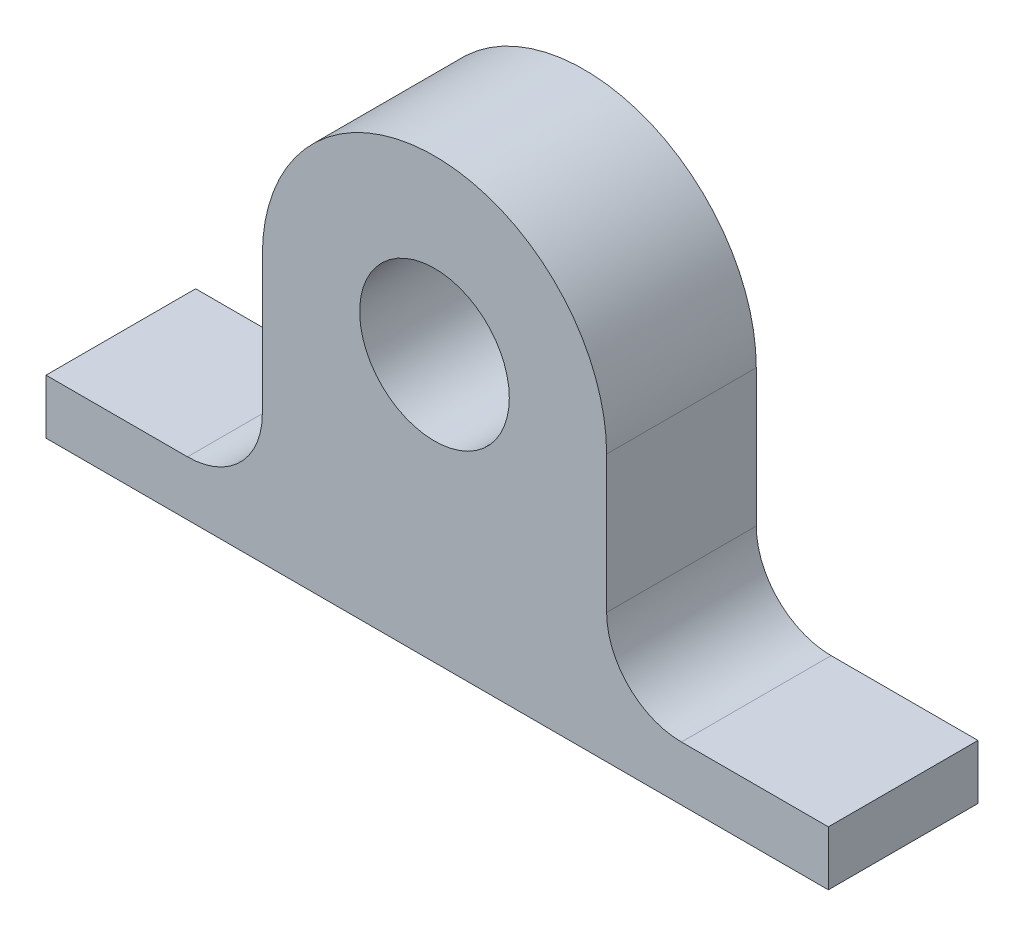
ISO-10303-21;
HEADER;
FILE_DESCRIPTION(('STEP AP214'),'2;1');
FILE_NAME('part.step','',(''),(''),'','','');
FILE_SCHEMA(('AUTOMOTIVE_DESIGN { 1 0 10303 214 1 1 1 1 }'));
ENDSEC;
DATA;
#1=APPLICATION_CONTEXT('core data for automotive mechanical design processes');
#2=APPLICATION_PROTOCOL_DEFINITION('international standard','automotive_design',2000,#1);
#3=PRODUCT_CONTEXT('',#1,'mechanical');
#4=PRODUCT('Part','Part','',(#3));
#5=PRODUCT_RELATED_PRODUCT_CATEGORY('part','',(#4));
#6=PRODUCT_DEFINITION_FORMATION('','',#4);
#7=PRODUCT_DEFINITION_CONTEXT('part definition',#1,'design');
#8=PRODUCT_DEFINITION('design','',#6,#7);
#9=PRODUCT_DEFINITION_SHAPE('','',#8);
#10=(LENGTH_UNIT() NAMED_UNIT(*) SI_UNIT(.MILLI.,.METRE.));
#11=(NAMED_UNIT(*) PLANE_ANGLE_UNIT() SI_UNIT($,.RADIAN.));
#12=(NAMED_UNIT(*) SI_UNIT($,.STERADIAN.) SOLID_ANGLE_UNIT());
#13=UNCERTAINTY_MEASURE_WITH_UNIT(LENGTH_MEASURE(1.E-05),#10,'distance_accuracy_value','');
#14=(GEOMETRIC_REPRESENTATION_CONTEXT(3) GLOBAL_UNCERTAINTY_ASSIGNED_CONTEXT((#13)) GLOBAL_UNIT_ASSIGNED_CONTEXT((#10,
#11,#12)) REPRESENTATION_CONTEXT('',''));
#15=CARTESIAN_POINT('',(0.,0.,0.));
#16=DIRECTION('',(0.,0.,1.));
#17=DIRECTION('',(1.,0.,0.));
#18=AXIS2_PLACEMENT_3D('',#15,#16,#17);
#19=CARTESIAN_POINT('',(13.2026271729039,6.91860551407242,8.));
#20=DIRECTION('',(0.,0.,-1.));
#21=DIRECTION('',(-1.,0.,0.));
#22=AXIS2_PLACEMENT_3D('',#19,#20,#21);
#23=PLANE('',#22);
#24=DIRECTION('',(1.,0.,0.));
#25=VECTOR('',#24,1.);
#26=CARTESIAN_POINT('',(-20.7673383673759,0.,8.));
#27=LINE('',#26,#25);
#28=CARTESIAN_POINT('',(-20.7673383673759,0.,8.));
#29=VERTEX_POINT('',#28);
#30=CARTESIAN_POINT('',(21.055610971604,0.,8.));
#31=VERTEX_POINT('',#30);
#32=EDGE_CURVE('E161',#29,#31,#27,.T.);
#33=ORIENTED_EDGE('',*,*,#32,.T.);
#34=DIRECTION('',(0.,1.,0.));
#35=VECTOR('',#34,1.);
#36=CARTESIAN_POINT('',(21.055610971604,0.,8.));
#37=LINE('',#36,#35);
#38=CARTESIAN_POINT('',(21.055610971604,2.91860551407242,8.));
#39=VERTEX_POINT('',#38);
#40=EDGE_CURVE('E99',#31,#39,#37,.T.);
#41=ORIENTED_EDGE('',*,*,#40,.T.);
#42=DIRECTION('',(-1.,0.,0.));
#43=VECTOR('',#42,1.);
#44=CARTESIAN_POINT('',(21.055610971604,2.91860551407242,8.));
#45=LINE('',#44,#43);
#46=CARTESIAN_POINT('',(13.2026271729039,2.91860551407242,8.));
#47=VERTEX_POINT('',#46);
#48=EDGE_CURVE('E182',#39,#47,#45,.T.);
#49=ORIENTED_EDGE('',*,*,#48,.T.);
#50=CARTESIAN_POINT('',(13.2026271729039,6.91860551407242,8.));
#51=DIRECTION('',(0.,0.,-1.));
#52=DIRECTION('',(-1.,0.,0.));
#53=AXIS2_PLACEMENT_3D('',#50,#51,#52);
#54=CIRCLE('',#53,4.);
#55=CARTESIAN_POINT('',(9.20262717290386,6.91860551407245,8.));
#56=VERTEX_POINT('',#55);
#57=EDGE_CURVE('E201',#47,#56,#54,.T.);
#58=ORIENTED_EDGE('',*,*,#57,.T.);
#59=DIRECTION('',(0.,1.,0.));
#60=VECTOR('',#59,1.);
#61=CARTESIAN_POINT('',(9.20262717290386,6.91860551407245,8.));
#62=LINE('',#61,#60);
#63=CARTESIAN_POINT('',(9.20262717290386,14.25,8.));
#64=VERTEX_POINT('',#63);
#65=EDGE_CURVE('E198',#56,#64,#62,.T.);
#66=ORIENTED_EDGE('',*,*,#65,.T.);
#67=CARTESIAN_POINT('',(0.,14.25,8.));
#68=DIRECTION('',(0.,0.,1.));
#69=DIRECTION('',(-1.,0.,0.));
#70=AXIS2_PLACEMENT_3D('',#67,#68,#69);
#71=CIRCLE('',#70,9.20262717290385);
#72=CARTESIAN_POINT('',(-9.20262717290384,14.25,8.));
#73=VERTEX_POINT('',#72);
#74=EDGE_CURVE('E200',#64,#73,#71,.T.);
#75=ORIENTED_EDGE('',*,*,#74,.T.);
#76=DIRECTION('',(0.,-1.,0.));
#77=VECTOR('',#76,1.);
#78=CARTESIAN_POINT('',(-9.20262717290384,6.91860551407245,8.));
#79=LINE('',#78,#77);
#80=CARTESIAN_POINT('',(-9.20262717290384,6.91860551407245,8.));
#81=VERTEX_POINT('',#80);
#82=EDGE_CURVE('E124',#73,#81,#79,.T.);
#83=ORIENTED_EDGE('',*,*,#82,.T.);
#84=CARTESIAN_POINT('',(-13.2026271729038,6.91860551407242,8.));
#85=DIRECTION('',(0.,0.,-1.));
#86=DIRECTION('',(-1.,0.,0.));
#87=AXIS2_PLACEMENT_3D('',#84,#85,#86);
#88=CIRCLE('',#87,4.);
#89=CARTESIAN_POINT('',(-13.2026271729039,2.91860551407242,8.));
#90=VERTEX_POINT('',#89);
#91=EDGE_CURVE('E118',#81,#90,#88,.T.);
#92=ORIENTED_EDGE('',*,*,#91,.T.);
#93=DIRECTION('',(-1.,0.,0.));
#94=VECTOR('',#93,1.);
#95=CARTESIAN_POINT('',(-20.7673383673759,2.91860551407242,8.));
#96=LINE('',#95,#94);
#97=CARTESIAN_POINT('',(-20.7673383673759,2.91860551407242,8.));
#98=VERTEX_POINT('',#97);
#99=EDGE_CURVE('E122',#90,#98,#96,.T.);
#100=ORIENTED_EDGE('',*,*,#99,.T.);
#101=DIRECTION('',(0.,-1.,0.));
#102=VECTOR('',#101,1.);
#103=CARTESIAN_POINT('',(-20.7673383673759,0.,8.));
#104=LINE('',#103,#102);
#105=EDGE_CURVE('E50',#98,#29,#104,.T.);
#106=ORIENTED_EDGE('',*,*,#105,.T.);
#107=EDGE_LOOP('',(#33,#41,#49,#58,#66,#75,#83,#92,#100,#106));
#108=FACE_BOUND('',#107,.T.);
#109=CARTESIAN_POINT('',(0.,14.25,8.));
#110=DIRECTION('',(0.,0.,1.));
#111=DIRECTION('',(1.,0.,0.));
#112=AXIS2_PLACEMENT_3D('',#109,#110,#111);
#113=CIRCLE('',#112,4.);
#114=CARTESIAN_POINT('',(4.00000000000001,14.25,8.));
#115=VERTEX_POINT('',#114);
#116=EDGE_CURVE('E146',#115,#115,#113,.T.);
#117=ORIENTED_EDGE('',*,*,#116,.F.);
#118=EDGE_LOOP('',(#117));
#119=FACE_BOUND('',#118,.T.);
#120=ADVANCED_FACE('F33',(#108,#119),#23,.F.);
#121=CARTESIAN_POINT('',(13.2026271729039,6.91860551407242,0.));
#122=DIRECTION('',(0.,0.,-1.));
#123=DIRECTION('',(-1.,0.,0.));
#124=AXIS2_PLACEMENT_3D('',#121,#122,#123);
#125=PLANE('',#124);
#126=DIRECTION('',(1.,0.,0.));
#127=VECTOR('',#126,1.);
#128=CARTESIAN_POINT('',(-20.7673383673759,0.,0.));
#129=LINE('',#128,#127);
#130=CARTESIAN_POINT('',(-20.7673383673759,0.,0.));
#131=VERTEX_POINT('',#130);
#132=CARTESIAN_POINT('',(21.055610971604,0.,0.));
#133=VERTEX_POINT('',#132);
#134=EDGE_CURVE('E142',#131,#133,#129,.T.);
#135=ORIENTED_EDGE('',*,*,#134,.F.);
#136=DIRECTION('',(0.,-1.,0.));
#137=VECTOR('',#136,1.);
#138=CARTESIAN_POINT('',(-20.7673383673759,0.,0.));
#139=LINE('',#138,#137);
#140=CARTESIAN_POINT('',(-20.7673383673759,2.91860551407242,0.));
#141=VERTEX_POINT('',#140);
#142=EDGE_CURVE('E91',#141,#131,#139,.T.);
#143=ORIENTED_EDGE('',*,*,#142,.F.);
#144=DIRECTION('',(-1.,0.,0.));
#145=VECTOR('',#144,1.);
#146=CARTESIAN_POINT('',(-20.7673383673759,2.91860551407242,0.));
#147=LINE('',#146,#145);
#148=CARTESIAN_POINT('',(-13.2026271729039,2.91860551407242,0.));
#149=VERTEX_POINT('',#148);
#150=EDGE_CURVE('E85',#149,#141,#147,.T.);
#151=ORIENTED_EDGE('',*,*,#150,.F.);
#152=CARTESIAN_POINT('',(-13.2026271729038,6.91860551407242,0.));
#153=DIRECTION('',(0.,0.,-1.));
#154=DIRECTION('',(-1.,0.,0.));
#155=AXIS2_PLACEMENT_3D('',#152,#153,#154);
#156=CIRCLE('',#155,4.);
#157=CARTESIAN_POINT('',(-9.20262717290384,6.91860551407245,0.));
#158=VERTEX_POINT('',#157);
#159=EDGE_CURVE('E132',#158,#149,#156,.T.);
#160=ORIENTED_EDGE('',*,*,#159,.F.);
#161=DIRECTION('',(0.,-1.,0.));
#162=VECTOR('',#161,1.);
#163=CARTESIAN_POINT('',(-9.20262717290384,6.91860551407245,0.));
#164=LINE('',#163,#162);
#165=CARTESIAN_POINT('',(-9.20262717290384,14.25,0.));
#166=VERTEX_POINT('',#165);
#167=EDGE_CURVE('E156',#166,#158,#164,.T.);
#168=ORIENTED_EDGE('',*,*,#167,.F.);
#169=CARTESIAN_POINT('',(0.,14.25,0.));
#170=DIRECTION('',(0.,0.,1.));
#171=DIRECTION('',(-1.,0.,0.));
#172=AXIS2_PLACEMENT_3D('',#169,#170,#171);
#173=CIRCLE('',#172,9.20262717290385);
#174=CARTESIAN_POINT('',(9.20262717290386,14.25,0.));
#175=VERTEX_POINT('',#174);
#176=EDGE_CURVE('E154',#175,#166,#173,.T.);
#177=ORIENTED_EDGE('',*,*,#176,.F.);
#178=DIRECTION('',(0.,1.,0.));
#179=VECTOR('',#178,1.);
#180=CARTESIAN_POINT('',(9.20262717290386,6.91860551407245,0.));
#181=LINE('',#180,#179);
#182=CARTESIAN_POINT('',(9.20262717290386,6.91860551407245,0.));
#183=VERTEX_POINT('',#182);
#184=EDGE_CURVE('E152',#183,#175,#181,.T.);
#185=ORIENTED_EDGE('',*,*,#184,.F.);
#186=CARTESIAN_POINT('',(13.2026271729039,6.91860551407242,0.));
#187=DIRECTION('',(0.,0.,-1.));
#188=DIRECTION('',(-1.,0.,0.));
#189=AXIS2_PLACEMENT_3D('',#186,#187,#188);
#190=CIRCLE('',#189,4.);
#191=CARTESIAN_POINT('',(13.2026271729039,2.91860551407242,0.));
#192=VERTEX_POINT('',#191);
#193=EDGE_CURVE('E150',#192,#183,#190,.T.);
#194=ORIENTED_EDGE('',*,*,#193,.F.);
#195=DIRECTION('',(-1.,0.,0.));
#196=VECTOR('',#195,1.);
#197=CARTESIAN_POINT('',(21.055610971604,2.91860551407242,0.));
#198=LINE('',#197,#196);
#199=CARTESIAN_POINT('',(21.055610971604,2.91860551407242,0.));
#200=VERTEX_POINT('',#199);
#201=EDGE_CURVE('E148',#200,#192,#198,.T.);
#202=ORIENTED_EDGE('',*,*,#201,.F.);
#203=DIRECTION('',(0.,1.,0.));
#204=VECTOR('',#203,1.);
#205=CARTESIAN_POINT('',(21.055610971604,0.,0.));
#206=LINE('',#205,#204);
#207=EDGE_CURVE('E145',#133,#200,#206,.T.);
#208=ORIENTED_EDGE('',*,*,#207,.F.);
#209=EDGE_LOOP('',(#135,#143,#151,#160,#168,#177,#185,#194,#202,#208));
#210=FACE_BOUND('',#209,.T.);
#211=CARTESIAN_POINT('',(0.,14.25,0.));
#212=DIRECTION('',(0.,0.,1.));
#213=DIRECTION('',(1.,0.,0.));
#214=AXIS2_PLACEMENT_3D('',#211,#212,#213);
#215=CIRCLE('',#214,4.);
#216=CARTESIAN_POINT('',(4.00000000000001,14.25,0.));
#217=VERTEX_POINT('',#216);
#218=EDGE_CURVE('E209',#217,#217,#215,.T.);
#219=ORIENTED_EDGE('',*,*,#218,.T.);
#220=EDGE_LOOP('',(#219));
#221=FACE_BOUND('',#220,.T.);
#222=ADVANCED_FACE('F186',(#210,#221),#125,.T.);
#223=CARTESIAN_POINT('',(-20.7673383673759,0.,8.));
#224=DIRECTION('',(0.,1.,0.));
#225=DIRECTION('',(-1.,0.,0.));
#226=AXIS2_PLACEMENT_3D('',#223,#224,#225);
#227=PLANE('',#226);
#228=ORIENTED_EDGE('',*,*,#134,.T.);
#229=DIRECTION('',(0.,0.,-1.));
#230=VECTOR('',#229,1.);
#231=CARTESIAN_POINT('',(21.055610971604,0.,8.));
#232=LINE('',#231,#230);
#233=EDGE_CURVE('E11',#31,#133,#232,.T.);
#234=ORIENTED_EDGE('',*,*,#233,.F.);
#235=ORIENTED_EDGE('',*,*,#32,.F.);
#236=DIRECTION('',(0.,0.,-1.));
#237=VECTOR('',#236,1.);
#238=CARTESIAN_POINT('',(-20.7673383673759,0.,8.));
#239=LINE('',#238,#237);
#240=EDGE_CURVE('E138',#29,#131,#239,.T.);
#241=ORIENTED_EDGE('',*,*,#240,.T.);
#242=EDGE_LOOP('',(#228,#234,#235,#241));
#243=FACE_BOUND('',#242,.T.);
#244=ADVANCED_FACE('F35',(#243),#227,.F.);
#245=CARTESIAN_POINT('',(21.055610971604,0.,8.));
#246=DIRECTION('',(-1.,0.,0.));
#247=DIRECTION('',(0.,0.,1.));
#248=AXIS2_PLACEMENT_3D('',#245,#246,#247);
#249=PLANE('',#248);
#250=ORIENTED_EDGE('',*,*,#207,.T.);
#251=DIRECTION('',(0.,0.,-1.));
#252=VECTOR('',#251,1.);
#253=CARTESIAN_POINT('',(21.055610971604,2.91860551407242,8.));
#254=LINE('',#253,#252);
#255=EDGE_CURVE('E42',#39,#200,#254,.T.);
#256=ORIENTED_EDGE('',*,*,#255,.F.);
#257=ORIENTED_EDGE('',*,*,#40,.F.);
#258=ORIENTED_EDGE('',*,*,#233,.T.);
#259=EDGE_LOOP('',(#250,#256,#257,#258));
#260=FACE_BOUND('',#259,.T.);
#261=ADVANCED_FACE('F245',(#260),#249,.F.);
#262=CARTESIAN_POINT('',(21.055610971604,2.91860551407242,8.));
#263=DIRECTION('',(0.,-1.,0.));
#264=DIRECTION('',(0.,0.,-1.));
#265=AXIS2_PLACEMENT_3D('',#262,#263,#264);
#266=PLANE('',#265);
#267=ORIENTED_EDGE('',*,*,#201,.T.);
#268=DIRECTION('',(0.,0.,-1.));
#269=VECTOR('',#268,1.);
#270=CARTESIAN_POINT('',(13.2026271729039,2.91860551407242,8.));
#271=LINE('',#270,#269);
#272=EDGE_CURVE('E174',#47,#192,#271,.T.);
#273=ORIENTED_EDGE('',*,*,#272,.F.);
#274=ORIENTED_EDGE('',*,*,#48,.F.);
#275=ORIENTED_EDGE('',*,*,#255,.T.);
#276=EDGE_LOOP('',(#267,#273,#274,#275));
#277=FACE_BOUND('',#276,.T.);
#278=ADVANCED_FACE('F180',(#277),#266,.F.);
#279=CARTESIAN_POINT('',(13.2026271729039,6.91860551407242,8.));
#280=DIRECTION('',(0.,0.,-1.));
#281=DIRECTION('',(-1.,0.,0.));
#282=AXIS2_PLACEMENT_3D('',#279,#280,#281);
#283=CYLINDRICAL_SURFACE('',#282,4.);
#284=ORIENTED_EDGE('',*,*,#193,.T.);
#285=DIRECTION('',(0.,0.,-1.));
#286=VECTOR('',#285,1.);
#287=CARTESIAN_POINT('',(9.20262717290386,6.91860551407245,8.));
#288=LINE('',#287,#286);
#289=EDGE_CURVE('E171',#56,#183,#288,.T.);
#290=ORIENTED_EDGE('',*,*,#289,.F.);
#291=ORIENTED_EDGE('',*,*,#57,.F.);
#292=ORIENTED_EDGE('',*,*,#272,.T.);
#293=EDGE_LOOP('',(#284,#290,#291,#292));
#294=FACE_BOUND('',#293,.T.);
#295=ADVANCED_FACE('F192',(#294),#283,.F.);
#296=CARTESIAN_POINT('',(9.20262717290386,6.91860551407245,8.));
#297=DIRECTION('',(-1.,0.,0.));
#298=DIRECTION('',(0.,0.,1.));
#299=AXIS2_PLACEMENT_3D('',#296,#297,#298);
#300=PLANE('',#299);
#301=ORIENTED_EDGE('',*,*,#184,.T.);
#302=DIRECTION('',(0.,0.,-1.));
#303=VECTOR('',#302,1.);
#304=CARTESIAN_POINT('',(9.20262717290386,14.25,8.));
#305=LINE('',#304,#303);
#306=EDGE_CURVE('E168',#64,#175,#305,.T.);
#307=ORIENTED_EDGE('',*,*,#306,.F.);
#308=ORIENTED_EDGE('',*,*,#65,.F.);
#309=ORIENTED_EDGE('',*,*,#289,.T.);
#310=EDGE_LOOP('',(#301,#307,#308,#309));
#311=FACE_BOUND('',#310,.T.);
#312=ADVANCED_FACE('F196',(#311),#300,.F.);
#313=CARTESIAN_POINT('',(0.,14.25,8.));
#314=DIRECTION('',(0.,0.,-1.));
#315=DIRECTION('',(-1.,0.,0.));
#316=AXIS2_PLACEMENT_3D('',#313,#314,#315);
#317=CYLINDRICAL_SURFACE('',#316,9.20262717290385);
#318=ORIENTED_EDGE('',*,*,#176,.T.);
#319=DIRECTION('',(0.,0.,-1.));
#320=VECTOR('',#319,1.);
#321=CARTESIAN_POINT('',(-9.20262717290384,14.25,8.));
#322=LINE('',#321,#320);
#323=EDGE_CURVE('E165',#73,#166,#322,.T.);
#324=ORIENTED_EDGE('',*,*,#323,.F.);
#325=ORIENTED_EDGE('',*,*,#74,.F.);
#326=ORIENTED_EDGE('',*,*,#306,.T.);
#327=EDGE_LOOP('',(#318,#324,#325,#326));
#328=FACE_BOUND('',#327,.T.);
#329=ADVANCED_FACE('F235',(#328),#317,.T.);
#330=CARTESIAN_POINT('',(-9.20262717290384,6.91860551407245,8.));
#331=DIRECTION('',(1.,0.,0.));
#332=DIRECTION('',(0.,0.,-1.));
#333=AXIS2_PLACEMENT_3D('',#330,#331,#332);
#334=PLANE('',#333);
#335=ORIENTED_EDGE('',*,*,#167,.T.);
#336=DIRECTION('',(0.,0.,-1.));
#337=VECTOR('',#336,1.);
#338=CARTESIAN_POINT('',(-9.20262717290384,6.91860551407245,8.));
#339=LINE('',#338,#337);
#340=EDGE_CURVE('E133',#81,#158,#339,.T.);
#341=ORIENTED_EDGE('',*,*,#340,.F.);
#342=ORIENTED_EDGE('',*,*,#82,.F.);
#343=ORIENTED_EDGE('',*,*,#323,.T.);
#344=EDGE_LOOP('',(#335,#341,#342,#343));
#345=FACE_BOUND('',#344,.T.);
#346=ADVANCED_FACE('F232',(#345),#334,.F.);
#347=CARTESIAN_POINT('',(-13.2026271729038,6.91860551407242,8.));
#348=DIRECTION('',(0.,0.,-1.));
#349=DIRECTION('',(-1.,0.,0.));
#350=AXIS2_PLACEMENT_3D('',#347,#348,#349);
#351=CYLINDRICAL_SURFACE('',#350,4.);
#352=ORIENTED_EDGE('',*,*,#159,.T.);
#353=DIRECTION('',(0.,0.,-1.));
#354=VECTOR('',#353,1.);
#355=CARTESIAN_POINT('',(-13.2026271729039,2.91860551407242,8.));
#356=LINE('',#355,#354);
#357=EDGE_CURVE('E129',#90,#149,#356,.T.);
#358=ORIENTED_EDGE('',*,*,#357,.F.);
#359=ORIENTED_EDGE('',*,*,#91,.F.);
#360=ORIENTED_EDGE('',*,*,#340,.T.);
#361=EDGE_LOOP('',(#352,#358,#359,#360));
#362=FACE_BOUND('',#361,.T.);
#363=ADVANCED_FACE('F130',(#362),#351,.F.);
#364=CARTESIAN_POINT('',(-20.7673383673759,2.91860551407242,8.));
#365=DIRECTION('',(0.,-1.,0.));
#366=DIRECTION('',(0.,0.,-1.));
#367=AXIS2_PLACEMENT_3D('',#364,#365,#366);
#368=PLANE('',#367);
#369=ORIENTED_EDGE('',*,*,#150,.T.);
#370=DIRECTION('',(0.,0.,-1.));
#371=VECTOR('',#370,1.);
#372=CARTESIAN_POINT('',(-20.7673383673759,2.91860551407242,8.));
#373=LINE('',#372,#371);
#374=EDGE_CURVE('E134',#98,#141,#373,.T.);
#375=ORIENTED_EDGE('',*,*,#374,.F.);
#376=ORIENTED_EDGE('',*,*,#99,.F.);
#377=ORIENTED_EDGE('',*,*,#357,.T.);
#378=EDGE_LOOP('',(#369,#375,#376,#377));
#379=FACE_BOUND('',#378,.T.);
#380=ADVANCED_FACE('F136',(#379),#368,.F.);
#381=CARTESIAN_POINT('',(-20.7673383673759,0.,8.));
#382=DIRECTION('',(1.,0.,0.));
#383=DIRECTION('',(0.,0.,-1.));
#384=AXIS2_PLACEMENT_3D('',#381,#382,#383);
#385=PLANE('',#384);
#386=ORIENTED_EDGE('',*,*,#142,.T.);
#387=ORIENTED_EDGE('',*,*,#240,.F.);
#388=ORIENTED_EDGE('',*,*,#105,.F.);
#389=ORIENTED_EDGE('',*,*,#374,.T.);
#390=EDGE_LOOP('',(#386,#387,#388,#389));
#391=FACE_BOUND('',#390,.T.);
#392=ADVANCED_FACE('F225',(#391),#385,.F.);
#393=CARTESIAN_POINT('',(0.,14.25,8.));
#394=DIRECTION('',(0.,0.,-1.));
#395=DIRECTION('',(-1.,0.,0.));
#396=AXIS2_PLACEMENT_3D('',#393,#394,#395);
#397=CYLINDRICAL_SURFACE('',#396,4.);
#398=ORIENTED_EDGE('',*,*,#116,.T.);
#399=EDGE_LOOP('',(#398));
#400=FACE_BOUND('',#399,.T.);
#401=ORIENTED_EDGE('',*,*,#218,.F.);
#402=EDGE_LOOP('',(#401));
#403=FACE_BOUND('',#402,.T.);
#404=ADVANCED_FACE('F215',(#400,#403),#397,.F.);
#405=CLOSED_SHELL('',(#120,#222,#244,#261,#278,#295,#312,#329,#346,#363,#380,#392,#404));
#406=MANIFOLD_SOLID_BREP('B2',#405);
#407=ADVANCED_BREP_SHAPE_REPRESENTATION('',(#18,#406),#14);
#408=SHAPE_DEFINITION_REPRESENTATION(#9,#407);
ENDSEC;
END-ISO-10303-21;
